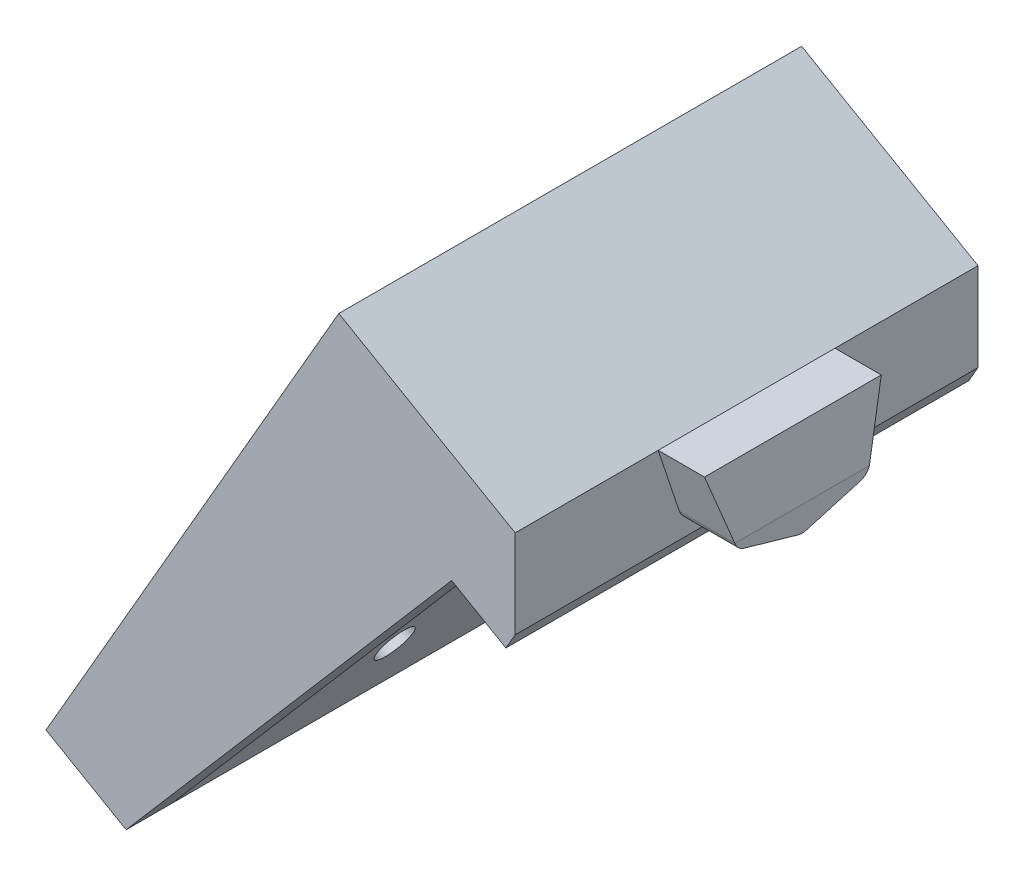
ISO-10303-21;
HEADER;
FILE_DESCRIPTION(('STEP AP214'),'2;1');
FILE_NAME('part.step','',(''),(''),'','','');
FILE_SCHEMA(('AUTOMOTIVE_DESIGN { 1 0 10303 214 1 1 1 1 }'));
ENDSEC;
DATA;
#1=APPLICATION_CONTEXT('core data for automotive mechanical design processes');
#2=APPLICATION_PROTOCOL_DEFINITION('international standard','automotive_design',2000,#1);
#3=PRODUCT_CONTEXT('',#1,'mechanical');
#4=PRODUCT('Part','Part','',(#3));
#5=PRODUCT_RELATED_PRODUCT_CATEGORY('part','',(#4));
#6=PRODUCT_DEFINITION_FORMATION('','',#4);
#7=PRODUCT_DEFINITION_CONTEXT('part definition',#1,'design');
#8=PRODUCT_DEFINITION('design','',#6,#7);
#9=PRODUCT_DEFINITION_SHAPE('','',#8);
#10=(LENGTH_UNIT() NAMED_UNIT(*) SI_UNIT(.MILLI.,.METRE.));
#11=(NAMED_UNIT(*) PLANE_ANGLE_UNIT() SI_UNIT($,.RADIAN.));
#12=(NAMED_UNIT(*) SI_UNIT($,.STERADIAN.) SOLID_ANGLE_UNIT());
#13=UNCERTAINTY_MEASURE_WITH_UNIT(LENGTH_MEASURE(1.E-05),#10,'distance_accuracy_value','');
#14=(GEOMETRIC_REPRESENTATION_CONTEXT(3) GLOBAL_UNCERTAINTY_ASSIGNED_CONTEXT((#13)) GLOBAL_UNIT_ASSIGNED_CONTEXT((#10,
#11,#12)) REPRESENTATION_CONTEXT('',''));
#15=CARTESIAN_POINT('',(0.,0.,0.));
#16=DIRECTION('',(0.,0.,1.));
#17=DIRECTION('',(1.,0.,0.));
#18=AXIS2_PLACEMENT_3D('',#15,#16,#17);
#19=CARTESIAN_POINT('',(-50.6833247791483,-43.7860936139999,25.));
#20=DIRECTION('',(0.499999999999998,0.86602540378444,0.));
#21=DIRECTION('',(-0.86602540378444,0.499999999999998,0.));
#22=AXIS2_PLACEMENT_3D('',#19,#20,#21);
#23=PLANE('',#22);
#24=DIRECTION('',(0.,0.,-1.));
#25=VECTOR('',#24,1.);
#26=CARTESIAN_POINT('',(-42.0230707413039,-48.7860936139999,25.));
#27=LINE('',#26,#25);
#28=CARTESIAN_POINT('',(-42.0230707413039,-48.7860936139999,25.));
#29=VERTEX_POINT('',#28);
#30=CARTESIAN_POINT('',(-42.0230707413039,-48.7860936139999,20.));
#31=VERTEX_POINT('',#30);
#32=EDGE_CURVE('E452',#29,#31,#27,.T.);
#33=ORIENTED_EDGE('',*,*,#32,.F.);
#34=DIRECTION('',(0.86602540378444,-0.499999999999998,0.));
#35=VECTOR('',#34,1.);
#36=CARTESIAN_POINT('',(-50.6833247791483,-43.7860936139999,25.));
#37=LINE('',#36,#35);
#38=CARTESIAN_POINT('',(-50.6833247791483,-43.7860936139999,25.));
#39=VERTEX_POINT('',#38);
#40=EDGE_CURVE('E196',#39,#29,#37,.T.);
#41=ORIENTED_EDGE('',*,*,#40,.F.);
#42=DIRECTION('',(0.,0.,-1.));
#43=VECTOR('',#42,1.);
#44=CARTESIAN_POINT('',(-50.6833247791483,-43.7860936139999,25.));
#45=LINE('',#44,#43);
#46=CARTESIAN_POINT('',(-50.6833247791483,-43.7860936139999,-25.));
#47=VERTEX_POINT('',#46);
#48=EDGE_CURVE('E260',#39,#47,#45,.T.);
#49=ORIENTED_EDGE('',*,*,#48,.T.);
#50=DIRECTION('',(0.86602540378444,-0.499999999999998,0.));
#51=VECTOR('',#50,1.);
#52=CARTESIAN_POINT('',(-50.6833247791483,-43.7860936139999,-25.));
#53=LINE('',#52,#51);
#54=CARTESIAN_POINT('',(-42.0230707413039,-48.7860936139999,-25.));
#55=VERTEX_POINT('',#54);
#56=EDGE_CURVE('E237',#47,#55,#53,.T.);
#57=ORIENTED_EDGE('',*,*,#56,.T.);
#58=CARTESIAN_POINT('',(-42.0230707413039,-48.7860936139999,-20.));
#59=VERTEX_POINT('',#58);
#60=EDGE_CURVE('E197',#59,#55,#27,.T.);
#61=ORIENTED_EDGE('',*,*,#60,.F.);
#62=DIRECTION('',(0.,0.,-1.));
#63=VECTOR('',#62,1.);
#64=CARTESIAN_POINT('',(-42.0230707413039,-48.7860936139999,25.));
#65=LINE('',#64,#63);
#66=EDGE_CURVE('E258',#31,#59,#65,.T.);
#67=ORIENTED_EDGE('',*,*,#66,.F.);
#68=EDGE_LOOP('',(#33,#41,#49,#57,#61,#67));
#69=FACE_BOUND('',#68,.T.);
#70=ADVANCED_FACE('F45',(#69),#23,.F.);
#71=CARTESIAN_POINT('',(0.,0.,25.));
#72=DIRECTION('',(0.,0.,1.));
#73=DIRECTION('',(1.,0.,0.));
#74=AXIS2_PLACEMENT_3D('',#71,#72,#73);
#75=PLANE('',#74);
#76=ORIENTED_EDGE('',*,*,#40,.T.);
#77=DIRECTION('',(-0.651898743000838,-0.758306025872093,0.));
#78=VECTOR('',#77,1.);
#79=CARTESIAN_POINT('',(-42.0230707413039,-48.7860936139999,25.));
#80=LINE('',#79,#78);
#81=CARTESIAN_POINT('',(-6.86281670345966,-7.88674721342455,25.));
#82=VERTEX_POINT('',#81);
#83=EDGE_CURVE('E179',#82,#29,#80,.T.);
#84=ORIENTED_EDGE('',*,*,#83,.F.);
#85=DIRECTION('',(-0.86602540378444,0.499999999999998,0.));
#86=VECTOR('',#85,1.);
#87=CARTESIAN_POINT('',(-1.,-11.2716460153764,25.));
#88=LINE('',#87,#86);
#89=CARTESIAN_POINT('',(-1.,-11.2716460153764,25.));
#90=VERTEX_POINT('',#89);
#91=EDGE_CURVE('E194',#90,#82,#88,.T.);
#92=ORIENTED_EDGE('',*,*,#91,.F.);
#93=DIRECTION('',(0.499999999999998,0.86602540378444,0.));
#94=VECTOR('',#93,1.);
#95=CARTESIAN_POINT('',(-1.,-11.2716460153764,25.));
#96=LINE('',#95,#94);
#97=CARTESIAN_POINT('',(0.,-9.53959520780752,25.));
#98=VERTEX_POINT('',#97);
#99=EDGE_CURVE('E215',#90,#98,#96,.T.);
#100=ORIENTED_EDGE('',*,*,#99,.T.);
#101=DIRECTION('',(0.,-1.,0.));
#102=VECTOR('',#101,1.);
#103=CARTESIAN_POINT('',(0.,0.,25.));
#104=LINE('',#103,#102);
#105=CARTESIAN_POINT('',(0.,0.,25.));
#106=VERTEX_POINT('',#105);
#107=EDGE_CURVE('E248',#106,#98,#104,.T.);
#108=ORIENTED_EDGE('',*,*,#107,.F.);
#109=DIRECTION('',(-0.86602540378444,0.499999999999998,0.));
#110=VECTOR('',#109,1.);
#111=CARTESIAN_POINT('',(0.,0.,25.));
#112=LINE('',#111,#110);
#113=CARTESIAN_POINT('',(-19.0525588832577,11.,25.));
#114=VERTEX_POINT('',#113);
#115=EDGE_CURVE('E242',#106,#114,#112,.T.);
#116=ORIENTED_EDGE('',*,*,#115,.T.);
#117=DIRECTION('',(-0.499999999999998,-0.86602540378444,0.));
#118=VECTOR('',#117,1.);
#119=CARTESIAN_POINT('',(-19.0525588832577,11.,25.));
#120=LINE('',#119,#118);
#121=EDGE_CURVE('E245',#114,#39,#120,.T.);
#122=ORIENTED_EDGE('',*,*,#121,.T.);
#123=EDGE_LOOP('',(#76,#84,#92,#100,#108,#116,#122));
#124=FACE_BOUND('',#123,.T.);
#125=ADVANCED_FACE('F192',(#124),#75,.T.);
#126=CARTESIAN_POINT('',(0.,0.,-25.));
#127=DIRECTION('',(0.,0.,1.));
#128=DIRECTION('',(1.,0.,0.));
#129=AXIS2_PLACEMENT_3D('',#126,#127,#128);
#130=PLANE('',#129);
#131=DIRECTION('',(0.651898743000838,0.758306025872093,0.));
#132=VECTOR('',#131,1.);
#133=CARTESIAN_POINT('',(-0.0475872412977088,0.0409096878126175,-25.));
#134=LINE('',#133,#132);
#135=CARTESIAN_POINT('',(-6.86281670345966,-7.88674721342455,-25.));
#136=VERTEX_POINT('',#135);
#137=EDGE_CURVE('E70',#55,#136,#134,.T.);
#138=ORIENTED_EDGE('',*,*,#137,.F.);
#139=ORIENTED_EDGE('',*,*,#56,.F.);
#140=DIRECTION('',(-0.499999999999998,-0.86602540378444,0.));
#141=VECTOR('',#140,1.);
#142=CARTESIAN_POINT('',(-19.0525588832577,11.,-25.));
#143=LINE('',#142,#141);
#144=CARTESIAN_POINT('',(-19.0525588832577,11.,-25.));
#145=VERTEX_POINT('',#144);
#146=EDGE_CURVE('E234',#145,#47,#143,.T.);
#147=ORIENTED_EDGE('',*,*,#146,.F.);
#148=DIRECTION('',(-0.86602540378444,0.499999999999998,0.));
#149=VECTOR('',#148,1.);
#150=CARTESIAN_POINT('',(0.,0.,-25.));
#151=LINE('',#150,#149);
#152=CARTESIAN_POINT('',(0.,0.,-25.));
#153=VERTEX_POINT('',#152);
#154=EDGE_CURVE('E231',#153,#145,#151,.T.);
#155=ORIENTED_EDGE('',*,*,#154,.F.);
#156=DIRECTION('',(0.,-1.,0.));
#157=VECTOR('',#156,1.);
#158=CARTESIAN_POINT('',(0.,0.,-25.));
#159=LINE('',#158,#157);
#160=CARTESIAN_POINT('',(0.,-9.53959520780752,-25.));
#161=VERTEX_POINT('',#160);
#162=EDGE_CURVE('E240',#153,#161,#159,.T.);
#163=ORIENTED_EDGE('',*,*,#162,.T.);
#164=DIRECTION('',(0.499999999999998,0.86602540378444,0.));
#165=VECTOR('',#164,1.);
#166=CARTESIAN_POINT('',(-1.,-11.2716460153764,-25.));
#167=LINE('',#166,#165);
#168=CARTESIAN_POINT('',(-1.,-11.2716460153764,-25.));
#169=VERTEX_POINT('',#168);
#170=EDGE_CURVE('E217',#169,#161,#167,.T.);
#171=ORIENTED_EDGE('',*,*,#170,.F.);
#172=DIRECTION('',(0.86602540378444,-0.499999999999998,0.));
#173=VECTOR('',#172,1.);
#174=CARTESIAN_POINT('',(-15.5230707413041,-2.88674721342457,-25.));
#175=LINE('',#174,#173);
#176=EDGE_CURVE('E206',#136,#169,#175,.T.);
#177=ORIENTED_EDGE('',*,*,#176,.F.);
#178=EDGE_LOOP('',(#138,#139,#147,#155,#163,#171,#177));
#179=FACE_BOUND('',#178,.T.);
#180=ADVANCED_FACE('F364',(#179),#130,.F.);
#181=CARTESIAN_POINT('',(-6.86281670345965,-7.88674721342454,20.));
#182=DIRECTION('',(0.,0.,1.));
#183=DIRECTION('',(0.,-1.,0.));
#184=AXIS2_PLACEMENT_3D('',#181,#182,#183);
#185=PLANE('',#184);
#186=DIRECTION('',(0.651898743000838,0.758306025872093,0.));
#187=VECTOR('',#186,1.);
#188=CARTESIAN_POINT('',(-6.86281670345965,-7.88674721342454,20.));
#189=LINE('',#188,#187);
#190=CARTESIAN_POINT('',(-6.86281670345966,-7.88674721342455,20.));
#191=VERTEX_POINT('',#190);
#192=EDGE_CURVE('E182',#31,#191,#189,.T.);
#193=ORIENTED_EDGE('',*,*,#192,.F.);
#194=DIRECTION('',(0.499999999999998,0.86602540378444,0.));
#195=VECTOR('',#194,1.);
#196=CARTESIAN_POINT('',(-15.5230707413041,-2.88674721342456,20.));
#197=LINE('',#196,#195);
#198=CARTESIAN_POINT('',(-15.5230707413041,-2.88674721342457,20.));
#199=VERTEX_POINT('',#198);
#200=EDGE_CURVE('E187',#31,#199,#197,.T.);
#201=ORIENTED_EDGE('',*,*,#200,.T.);
#202=DIRECTION('',(-0.86602540378444,0.499999999999998,0.));
#203=VECTOR('',#202,1.);
#204=CARTESIAN_POINT('',(-6.86281670345965,-7.88674721342454,20.));
#205=LINE('',#204,#203);
#206=EDGE_CURVE('E186',#191,#199,#205,.T.);
#207=ORIENTED_EDGE('',*,*,#206,.F.);
#208=EDGE_LOOP('',(#193,#201,#207));
#209=FACE_BOUND('',#208,.T.);
#210=ADVANCED_FACE('F469',(#209),#185,.F.);
#211=CARTESIAN_POINT('',(-6.86281670345965,-7.88674721342454,-20.));
#212=DIRECTION('',(0.,0.,1.));
#213=DIRECTION('',(0.,-1.,0.));
#214=AXIS2_PLACEMENT_3D('',#211,#212,#213);
#215=PLANE('',#214);
#216=DIRECTION('',(0.499999999999998,0.86602540378444,0.));
#217=VECTOR('',#216,1.);
#218=CARTESIAN_POINT('',(-15.5230707413041,-2.88674721342456,-20.));
#219=LINE('',#218,#217);
#220=CARTESIAN_POINT('',(-15.5230707413041,-2.88674721342457,-20.));
#221=VERTEX_POINT('',#220);
#222=EDGE_CURVE('E62',#59,#221,#219,.T.);
#223=ORIENTED_EDGE('',*,*,#222,.F.);
#224=DIRECTION('',(0.651898743000838,0.758306025872093,0.));
#225=VECTOR('',#224,1.);
#226=CARTESIAN_POINT('',(-6.86281670345965,-7.88674721342454,-20.));
#227=LINE('',#226,#225);
#228=CARTESIAN_POINT('',(-6.86281670345966,-7.88674721342455,-20.));
#229=VERTEX_POINT('',#228);
#230=EDGE_CURVE('E454',#59,#229,#227,.T.);
#231=ORIENTED_EDGE('',*,*,#230,.T.);
#232=DIRECTION('',(-0.86602540378444,0.499999999999998,0.));
#233=VECTOR('',#232,1.);
#234=CARTESIAN_POINT('',(-6.86281670345965,-7.88674721342454,-20.));
#235=LINE('',#234,#233);
#236=EDGE_CURVE('E463',#229,#221,#235,.T.);
#237=ORIENTED_EDGE('',*,*,#236,.T.);
#238=EDGE_LOOP('',(#223,#231,#237));
#239=FACE_BOUND('',#238,.T.);
#240=ADVANCED_FACE('F472',(#239),#215,.T.);
#241=CARTESIAN_POINT('',(-42.0230707413039,-48.7860936139999,25.));
#242=DIRECTION('',(-0.86602540378444,0.499999999999998,0.));
#243=DIRECTION('',(-0.499999999999998,-0.86602540378444,0.));
#244=AXIS2_PLACEMENT_3D('',#241,#242,#243);
#245=PLANE('',#244);
#246=CARTESIAN_POINT('',(-38.023070741304,-41.8578903837244,0.));
#247=DIRECTION('',(-0.86602540378444,0.499999999999998,0.));
#248=DIRECTION('',(-0.499999999999998,-0.86602540378444,0.));
#249=AXIS2_PLACEMENT_3D('',#246,#247,#248);
#250=CIRCLE('',#249,2.);
#251=CARTESIAN_POINT('',(-39.023070741304,-43.5899411912932,0.));
#252=VERTEX_POINT('',#251);
#253=EDGE_CURVE('E204',#252,#252,#250,.T.);
#254=ORIENTED_EDGE('',*,*,#253,.T.);
#255=EDGE_LOOP('',(#254));
#256=FACE_BOUND('',#255,.T.);
#257=CARTESIAN_POINT('',(-30.523070741304,-28.8675093269578,0.));
#258=DIRECTION('',(-0.86602540378444,0.499999999999998,0.));
#259=DIRECTION('',(-0.499999999999998,-0.86602540378444,0.));
#260=AXIS2_PLACEMENT_3D('',#257,#258,#259);
#261=CIRCLE('',#260,2.);
#262=CARTESIAN_POINT('',(-31.523070741304,-30.5995601345267,0.));
#263=VERTEX_POINT('',#262);
#264=EDGE_CURVE('E209',#263,#263,#261,.T.);
#265=ORIENTED_EDGE('',*,*,#264,.T.);
#266=EDGE_LOOP('',(#265));
#267=FACE_BOUND('',#266,.T.);
#268=ORIENTED_EDGE('',*,*,#66,.T.);
#269=ORIENTED_EDGE('',*,*,#222,.T.);
#270=DIRECTION('',(0.,0.,-1.));
#271=VECTOR('',#270,1.);
#272=CARTESIAN_POINT('',(-15.5230707413041,-2.88674721342457,25.));
#273=LINE('',#272,#271);
#274=EDGE_CURVE('E203',#199,#221,#273,.T.);
#275=ORIENTED_EDGE('',*,*,#274,.F.);
#276=ORIENTED_EDGE('',*,*,#200,.F.);
#277=EDGE_LOOP('',(#268,#269,#275,#276));
#278=FACE_BOUND('',#277,.T.);
#279=ADVANCED_FACE('F339',(#256,#267,#278),#245,.F.);
#280=CARTESIAN_POINT('',(-5.13076589589079,-8.88674721342454,0.));
#281=DIRECTION('',(-0.499999999999998,-0.86602540378444,0.));
#282=DIRECTION('',(0.86602540378444,-0.499999999999998,0.));
#283=AXIS2_PLACEMENT_3D('',#280,#281,#282);
#284=PLANE('',#283);
#285=DIRECTION('',(0.,0.,1.));
#286=VECTOR('',#285,1.);
#287=CARTESIAN_POINT('',(-6.86281670345965,-7.88674721342454,25.));
#288=LINE('',#287,#286);
#289=EDGE_CURVE('E176',#191,#82,#288,.T.);
#290=ORIENTED_EDGE('',*,*,#289,.F.);
#291=ORIENTED_EDGE('',*,*,#206,.T.);
#292=ORIENTED_EDGE('',*,*,#274,.T.);
#293=ORIENTED_EDGE('',*,*,#236,.F.);
#294=DIRECTION('',(0.,0.,-1.));
#295=VECTOR('',#294,1.);
#296=CARTESIAN_POINT('',(-6.86281670345965,-7.88674721342454,-25.));
#297=LINE('',#296,#295);
#298=EDGE_CURVE('E461',#229,#136,#297,.T.);
#299=ORIENTED_EDGE('',*,*,#298,.T.);
#300=ORIENTED_EDGE('',*,*,#176,.T.);
#301=DIRECTION('',(0.,0.,1.));
#302=VECTOR('',#301,1.);
#303=CARTESIAN_POINT('',(-1.,-11.2716460153764,-25.));
#304=LINE('',#303,#302);
#305=EDGE_CURVE('E201',#169,#90,#304,.T.);
#306=ORIENTED_EDGE('',*,*,#305,.T.);
#307=ORIENTED_EDGE('',*,*,#91,.T.);
#308=EDGE_LOOP('',(#290,#291,#292,#293,#299,#300,#306,#307));
#309=FACE_BOUND('',#308,.T.);
#310=ADVANCED_FACE('F199',(#309),#284,.T.);
#311=CARTESIAN_POINT('',(-46.6833247791484,-36.8578903837244,0.));
#312=DIRECTION('',(-0.86602540378444,0.499999999999998,0.));
#313=DIRECTION('',(-0.499999999999998,-0.86602540378444,0.));
#314=AXIS2_PLACEMENT_3D('',#311,#312,#313);
#315=CYLINDRICAL_SURFACE('',#314,2.);
#316=ORIENTED_EDGE('',*,*,#253,.F.);
#317=EDGE_LOOP('',(#316));
#318=FACE_BOUND('',#317,.T.);
#319=CARTESIAN_POINT('',(-44.085248567795,-38.3578903837244,0.));
#320=DIRECTION('',(-0.86602540378444,0.499999999999998,0.));
#321=DIRECTION('',(-0.499999999999998,-0.86602540378444,0.));
#322=AXIS2_PLACEMENT_3D('',#319,#320,#321);
#323=CIRCLE('',#322,2.);
#324=CARTESIAN_POINT('',(-45.085248567795,-40.0899411912933,0.));
#325=VERTEX_POINT('',#324);
#326=EDGE_CURVE('E49',#325,#325,#323,.F.);
#327=ORIENTED_EDGE('',*,*,#326,.F.);
#328=EDGE_LOOP('',(#327));
#329=FACE_BOUND('',#328,.T.);
#330=ADVANCED_FACE('F345',(#318,#329),#315,.F.);
#331=CARTESIAN_POINT('',(-39.1833247791484,-23.8675093269578,0.));
#332=DIRECTION('',(-0.86602540378444,0.499999999999998,0.));
#333=DIRECTION('',(-0.499999999999998,-0.86602540378444,0.));
#334=AXIS2_PLACEMENT_3D('',#331,#332,#333);
#335=CYLINDRICAL_SURFACE('',#334,2.);
#336=ORIENTED_EDGE('',*,*,#264,.F.);
#337=EDGE_LOOP('',(#336));
#338=FACE_BOUND('',#337,.T.);
#339=CARTESIAN_POINT('',(-36.5852485677951,-25.3675093269578,0.));
#340=DIRECTION('',(-0.86602540378444,0.499999999999998,0.));
#341=DIRECTION('',(-0.499999999999998,-0.86602540378444,0.));
#342=AXIS2_PLACEMENT_3D('',#339,#340,#341);
#343=CIRCLE('',#342,2.);
#344=CARTESIAN_POINT('',(-37.5852485677951,-27.0995601345267,0.));
#345=VERTEX_POINT('',#344);
#346=EDGE_CURVE('E315',#345,#345,#343,.F.);
#347=ORIENTED_EDGE('',*,*,#346,.F.);
#348=EDGE_LOOP('',(#347));
#349=FACE_BOUND('',#348,.T.);
#350=ADVANCED_FACE('F341',(#338,#349),#335,.F.);
#351=CARTESIAN_POINT('',(-19.0525588832577,11.,25.));
#352=DIRECTION('',(0.86602540378444,-0.499999999999998,0.));
#353=DIRECTION('',(0.499999999999998,0.86602540378444,0.));
#354=AXIS2_PLACEMENT_3D('',#351,#352,#353);
#355=PLANE('',#354);
#356=CARTESIAN_POINT('',(-39.1833247791485,-23.8675093269579,0.));
#357=DIRECTION('',(-0.86602540378444,0.499999999999998,0.));
#358=DIRECTION('',(-0.499999999999998,-0.86602540378444,0.));
#359=AXIS2_PLACEMENT_3D('',#356,#357,#358);
#360=CIRCLE('',#359,3.7500000000005);
#361=CARTESIAN_POINT('',(-41.0583247791487,-27.11510459115,0.));
#362=VERTEX_POINT('',#361);
#363=EDGE_CURVE('E322',#362,#362,#360,.T.);
#364=ORIENTED_EDGE('',*,*,#363,.F.);
#365=EDGE_LOOP('',(#364));
#366=FACE_BOUND('',#365,.T.);
#367=CARTESIAN_POINT('',(-46.6833247791486,-36.8578903837248,3.32913026049791E-13));
#368=DIRECTION('',(-0.86602540378444,0.499999999999998,0.));
#369=DIRECTION('',(-0.499999999999998,-0.86602540378444,0.));
#370=AXIS2_PLACEMENT_3D('',#367,#368,#369);
#371=CIRCLE('',#370,3.74999999999927);
#372=CARTESIAN_POINT('',(-48.5583247791483,-40.1054856479159,3.32913026049791E-13));
#373=VERTEX_POINT('',#372);
#374=EDGE_CURVE('E327',#373,#373,#371,.T.);
#375=ORIENTED_EDGE('',*,*,#374,.F.);
#376=EDGE_LOOP('',(#375));
#377=FACE_BOUND('',#376,.T.);
#378=DIRECTION('',(0.,0.,-1.));
#379=VECTOR('',#378,1.);
#380=CARTESIAN_POINT('',(-19.0525588832577,11.,25.));
#381=LINE('',#380,#379);
#382=EDGE_CURVE('E262',#114,#145,#381,.T.);
#383=ORIENTED_EDGE('',*,*,#382,.T.);
#384=ORIENTED_EDGE('',*,*,#146,.T.);
#385=ORIENTED_EDGE('',*,*,#48,.F.);
#386=ORIENTED_EDGE('',*,*,#121,.F.);
#387=EDGE_LOOP('',(#383,#384,#385,#386));
#388=FACE_BOUND('',#387,.T.);
#389=ADVANCED_FACE('F344',(#366,#377,#388),#355,.F.);
#390=CARTESIAN_POINT('',(6.,0.,-9.55));
#391=DIRECTION('',(0.,0.316573765443062,0.94856789479362));
#392=DIRECTION('',(0.,-0.94856789479362,0.316573765443062));
#393=AXIS2_PLACEMENT_3D('',#390,#391,#392);
#394=PLANE('',#393);
#395=DIRECTION('',(-1.,0.,0.));
#396=VECTOR('',#395,1.);
#397=CARTESIAN_POINT('',(6.,0.,-9.55));
#398=LINE('',#397,#396);
#399=CARTESIAN_POINT('',(5.,0.,-9.55));
#400=VERTEX_POINT('',#399);
#401=CARTESIAN_POINT('',(0.,0.,-9.55));
#402=VERTEX_POINT('',#401);
#403=EDGE_CURVE('E285',#400,#402,#398,.T.);
#404=ORIENTED_EDGE('',*,*,#403,.F.);
#405=DIRECTION('',(0.13738157043212,-0.939573763524962,0.313572076245867));
#406=VECTOR('',#405,1.);
#407=CARTESIAN_POINT('',(5.0188736958944,-0.129080119169876,-9.50692097572168));
#408=LINE('',#407,#406);
#409=CARTESIAN_POINT('',(6.,-6.83915433904001,-7.26750988680972));
#410=VERTEX_POINT('',#409);
#411=EDGE_CURVE('E228',#400,#410,#408,.T.);
#412=ORIENTED_EDGE('',*,*,#411,.T.);
#413=DIRECTION('',(-1.,0.,0.));
#414=VECTOR('',#413,1.);
#415=CARTESIAN_POINT('',(6.,-6.83915433904001,-7.26750988680972));
#416=LINE('',#415,#414);
#417=CARTESIAN_POINT('',(0.,-6.83915433904001,-7.26750988680972));
#418=VERTEX_POINT('',#417);
#419=EDGE_CURVE('E11',#410,#418,#416,.T.);
#420=ORIENTED_EDGE('',*,*,#419,.T.);
#421=DIRECTION('',(0.,0.948567894793621,-0.316573765443062));
#422=VECTOR('',#421,1.);
#423=CARTESIAN_POINT('',(0.,0.,-9.55));
#424=LINE('',#423,#422);
#425=EDGE_CURVE('E264',#418,#402,#424,.T.);
#426=ORIENTED_EDGE('',*,*,#425,.T.);
#427=EDGE_LOOP('',(#404,#412,#420,#426));
#428=FACE_BOUND('',#427,.T.);
#429=ADVANCED_FACE('F351',(#428),#394,.F.);
#430=CARTESIAN_POINT('',(6.,0.,9.55));
#431=DIRECTION('',(0.,-1.,0.));
#432=DIRECTION('',(0.,0.,-1.));
#433=AXIS2_PLACEMENT_3D('',#430,#431,#432);
#434=PLANE('',#433);
#435=DIRECTION('',(-1.,0.,0.));
#436=VECTOR('',#435,1.);
#437=CARTESIAN_POINT('',(6.,0.,9.55));
#438=LINE('',#437,#436);
#439=CARTESIAN_POINT('',(5.,0.,9.55));
#440=VERTEX_POINT('',#439);
#441=CARTESIAN_POINT('',(0.,0.,9.55));
#442=VERTEX_POINT('',#441);
#443=EDGE_CURVE('E272',#440,#442,#438,.T.);
#444=ORIENTED_EDGE('',*,*,#443,.F.);
#445=DIRECTION('',(0.,0.,1.));
#446=VECTOR('',#445,1.);
#447=CARTESIAN_POINT('',(5.,0.,-25.));
#448=LINE('',#447,#446);
#449=EDGE_CURVE('E220',#400,#440,#448,.T.);
#450=ORIENTED_EDGE('',*,*,#449,.F.);
#451=ORIENTED_EDGE('',*,*,#403,.T.);
#452=DIRECTION('',(0.,0.,1.));
#453=VECTOR('',#452,1.);
#454=CARTESIAN_POINT('',(0.,0.,9.55));
#455=LINE('',#454,#453);
#456=EDGE_CURVE('E275',#402,#442,#455,.T.);
#457=ORIENTED_EDGE('',*,*,#456,.T.);
#458=EDGE_LOOP('',(#444,#450,#451,#457));
#459=FACE_BOUND('',#458,.T.);
#460=ADVANCED_FACE('F391',(#459),#434,.F.);
#461=CARTESIAN_POINT('',(6.,0.,9.55));
#462=DIRECTION('',(0.,0.316573765443062,-0.94856789479362));
#463=DIRECTION('',(0.,0.94856789479362,0.316573765443062));
#464=AXIS2_PLACEMENT_3D('',#461,#462,#463);
#465=PLANE('',#464);
#466=DIRECTION('',(-1.,0.,0.));
#467=VECTOR('',#466,1.);
#468=CARTESIAN_POINT('',(6.,-6.83915433904001,7.26750988680973));
#469=LINE('',#468,#467);
#470=CARTESIAN_POINT('',(0.,-6.83915433904001,7.26750988680972));
#471=VERTEX_POINT('',#470);
#472=CARTESIAN_POINT('',(6.,-6.83915433904001,7.26750988680972));
#473=VERTEX_POINT('',#472);
#474=EDGE_CURVE('E302',#471,#473,#469,.F.);
#475=ORIENTED_EDGE('',*,*,#474,.T.);
#476=DIRECTION('',(-0.13738157043212,0.939573763524962,0.313572076245867));
#477=VECTOR('',#476,1.);
#478=CARTESIAN_POINT('',(5.0188736958944,-0.129080119169876,9.50692097572168));
#479=LINE('',#478,#477);
#480=EDGE_CURVE('E224',#473,#440,#479,.T.);
#481=ORIENTED_EDGE('',*,*,#480,.T.);
#482=ORIENTED_EDGE('',*,*,#443,.T.);
#483=DIRECTION('',(0.,-0.948567894793621,-0.316573765443062));
#484=VECTOR('',#483,1.);
#485=CARTESIAN_POINT('',(0.,0.,9.55));
#486=LINE('',#485,#484);
#487=EDGE_CURVE('E278',#442,#471,#486,.T.);
#488=ORIENTED_EDGE('',*,*,#487,.T.);
#489=EDGE_LOOP('',(#475,#481,#482,#488));
#490=FACE_BOUND('',#489,.T.);
#491=ADVANCED_FACE('F387',(#490),#465,.F.);
#492=CARTESIAN_POINT('',(6.,-7.58854315834896,7.0174098764555));
#493=DIRECTION('',(0.,0.961289024171987,-0.275542033102881));
#494=DIRECTION('',(0.,0.275542033102881,0.961289024171987));
#495=AXIS2_PLACEMENT_3D('',#492,#493,#494);
#496=PLANE('',#495);
#497=DIRECTION('',(0.,-0.275542033102881,-0.961289024171987));
#498=VECTOR('',#497,1.);
#499=CARTESIAN_POINT('',(6.,-7.58854315834896,7.0174098764555));
#500=LINE('',#499,#498);
#501=CARTESIAN_POINT('',(6.,-7.8062272271334,6.25797109427362));
#502=VERTEX_POINT('',#501);
#503=CARTESIAN_POINT('',(6.,-9.4815287440655,0.413313049654324));
#504=VERTEX_POINT('',#503);
#505=EDGE_CURVE('E265',#502,#504,#500,.T.);
#506=ORIENTED_EDGE('',*,*,#505,.F.);
#507=DIRECTION('',(-1.,0.,0.));
#508=VECTOR('',#507,1.);
#509=CARTESIAN_POINT('',(6.,-7.8062272271334,6.25797109427362));
#510=LINE('',#509,#508);
#511=CARTESIAN_POINT('',(0.,-7.8062272271334,6.25797109427362));
#512=VERTEX_POINT('',#511);
#513=EDGE_CURVE('E289',#502,#512,#510,.T.);
#514=ORIENTED_EDGE('',*,*,#513,.T.);
#515=DIRECTION('',(0.,-0.275542033102881,-0.961289024171987));
#516=VECTOR('',#515,1.);
#517=CARTESIAN_POINT('',(0.,-7.58854315834896,7.0174098764555));
#518=LINE('',#517,#516);
#519=CARTESIAN_POINT('',(0.,-9.4815287440655,0.413313049654324));
#520=VERTEX_POINT('',#519);
#521=EDGE_CURVE('E280',#512,#520,#518,.T.);
#522=ORIENTED_EDGE('',*,*,#521,.T.);
#523=DIRECTION('',(-1.,0.,0.));
#524=VECTOR('',#523,1.);
#525=CARTESIAN_POINT('',(6.,-9.4815287440655,0.413313049654323));
#526=LINE('',#525,#524);
#527=EDGE_CURVE('E287',#520,#504,#526,.F.);
#528=ORIENTED_EDGE('',*,*,#527,.T.);
#529=EDGE_LOOP('',(#506,#514,#522,#528));
#530=FACE_BOUND('',#529,.T.);
#531=ADVANCED_FACE('F383',(#530),#496,.F.);
#532=CARTESIAN_POINT('',(6.,-7.58854315834896,-7.0174098764555));
#533=DIRECTION('',(0.,0.961289024171987,0.275542033102881));
#534=DIRECTION('',(0.,-0.275542033102881,0.961289024171987));
#535=AXIS2_PLACEMENT_3D('',#532,#533,#534);
#536=PLANE('',#535);
#537=DIRECTION('',(0.,0.275542033102881,-0.961289024171987));
#538=VECTOR('',#537,1.);
#539=CARTESIAN_POINT('',(6.,-7.58854315834896,-7.0174098764555));
#540=LINE('',#539,#538);
#541=CARTESIAN_POINT('',(6.,-9.4815287440655,-0.413313049654324));
#542=VERTEX_POINT('',#541);
#543=CARTESIAN_POINT('',(6.,-7.8062272271334,-6.25797109427362));
#544=VERTEX_POINT('',#543);
#545=EDGE_CURVE('E268',#542,#544,#540,.T.);
#546=ORIENTED_EDGE('',*,*,#545,.F.);
#547=DIRECTION('',(-1.,0.,0.));
#548=VECTOR('',#547,1.);
#549=CARTESIAN_POINT('',(6.,-9.4815287440655,-0.413313049654323));
#550=LINE('',#549,#548);
#551=CARTESIAN_POINT('',(0.,-9.4815287440655,-0.413313049654324));
#552=VERTEX_POINT('',#551);
#553=EDGE_CURVE('E54',#542,#552,#550,.T.);
#554=ORIENTED_EDGE('',*,*,#553,.T.);
#555=DIRECTION('',(0.,0.275542033102881,-0.961289024171987));
#556=VECTOR('',#555,1.);
#557=CARTESIAN_POINT('',(0.,-7.58854315834896,-7.0174098764555));
#558=LINE('',#557,#556);
#559=CARTESIAN_POINT('',(0.,-7.8062272271334,-6.25797109427362));
#560=VERTEX_POINT('',#559);
#561=EDGE_CURVE('E269',#552,#560,#558,.T.);
#562=ORIENTED_EDGE('',*,*,#561,.T.);
#563=DIRECTION('',(-1.,0.,0.));
#564=VECTOR('',#563,1.);
#565=CARTESIAN_POINT('',(6.,-7.8062272271334,-6.25797109427362));
#566=LINE('',#565,#564);
#567=EDGE_CURVE('E312',#560,#544,#566,.F.);
#568=ORIENTED_EDGE('',*,*,#567,.T.);
#569=EDGE_LOOP('',(#546,#554,#562,#568));
#570=FACE_BOUND('',#569,.T.);
#571=ADVANCED_FACE('F379',(#570),#536,.F.);
#572=CARTESIAN_POINT('',(6.,0.,0.));
#573=DIRECTION('',(1.,0.,0.));
#574=DIRECTION('',(0.,0.,-1.));
#575=AXIS2_PLACEMENT_3D('',#572,#573,#574);
#576=PLANE('',#575);
#577=DIRECTION('',(0.,0.,1.));
#578=VECTOR('',#577,1.);
#579=CARTESIAN_POINT('',(6.,-6.83915433904001,-25.));
#580=LINE('',#579,#578);
#581=EDGE_CURVE('E221',#410,#473,#580,.T.);
#582=ORIENTED_EDGE('',*,*,#581,.T.);
#583=CARTESIAN_POINT('',(6.,-6.36429369087542,5.84465804461929));
#584=DIRECTION('',(1.,0.,0.));
#585=DIRECTION('',(0.,0.,-1.));
#586=AXIS2_PLACEMENT_3D('',#583,#584,#585);
#587=CIRCLE('',#586,1.5);
#588=EDGE_CURVE('E310',#473,#502,#587,.T.);
#589=ORIENTED_EDGE('',*,*,#588,.T.);
#590=ORIENTED_EDGE('',*,*,#505,.T.);
#591=CARTESIAN_POINT('',(6.,-8.03959520780752,0.));
#592=DIRECTION('',(1.,0.,0.));
#593=DIRECTION('',(0.,0.,-1.));
#594=AXIS2_PLACEMENT_3D('',#591,#592,#593);
#595=CIRCLE('',#594,1.5);
#596=EDGE_CURVE('E308',#504,#542,#595,.T.);
#597=ORIENTED_EDGE('',*,*,#596,.T.);
#598=ORIENTED_EDGE('',*,*,#545,.T.);
#599=CARTESIAN_POINT('',(6.,-6.36429369087542,-5.84465804461929));
#600=DIRECTION('',(1.,0.,0.));
#601=DIRECTION('',(0.,0.,-1.));
#602=AXIS2_PLACEMENT_3D('',#599,#600,#601);
#603=CIRCLE('',#602,1.5);
#604=EDGE_CURVE('E305',#544,#410,#603,.T.);
#605=ORIENTED_EDGE('',*,*,#604,.T.);
#606=EDGE_LOOP('',(#582,#589,#590,#597,#598,#605));
#607=FACE_BOUND('',#606,.T.);
#608=ADVANCED_FACE('F375',(#607),#576,.T.);
#609=CARTESIAN_POINT('',(6.,-6.36429369087542,5.84465804461929));
#610=DIRECTION('',(-1.,0.,0.));
#611=DIRECTION('',(0.,0.,1.));
#612=AXIS2_PLACEMENT_3D('',#609,#610,#611);
#613=CYLINDRICAL_SURFACE('',#612,1.5);
#614=ORIENTED_EDGE('',*,*,#588,.F.);
#615=ORIENTED_EDGE('',*,*,#474,.F.);
#616=CARTESIAN_POINT('',(0.,-6.36429369087542,5.84465804461929));
#617=DIRECTION('',(1.,0.,0.));
#618=DIRECTION('',(0.,0.,-1.));
#619=AXIS2_PLACEMENT_3D('',#616,#617,#618);
#620=CIRCLE('',#619,1.5);
#621=EDGE_CURVE('E299',#512,#471,#620,.F.);
#622=ORIENTED_EDGE('',*,*,#621,.F.);
#623=ORIENTED_EDGE('',*,*,#513,.F.);
#624=EDGE_LOOP('',(#614,#615,#622,#623));
#625=FACE_BOUND('',#624,.T.);
#626=ADVANCED_FACE('F378',(#625),#613,.T.);
#627=CARTESIAN_POINT('',(6.,-8.03959520780752,0.));
#628=DIRECTION('',(-1.,0.,0.));
#629=DIRECTION('',(0.,0.,1.));
#630=AXIS2_PLACEMENT_3D('',#627,#628,#629);
#631=CYLINDRICAL_SURFACE('',#630,1.5);
#632=ORIENTED_EDGE('',*,*,#596,.F.);
#633=ORIENTED_EDGE('',*,*,#527,.F.);
#634=CARTESIAN_POINT('',(0.,-8.03959520780752,0.));
#635=DIRECTION('',(1.,0.,0.));
#636=DIRECTION('',(0.,0.,-1.));
#637=AXIS2_PLACEMENT_3D('',#634,#635,#636);
#638=CIRCLE('',#637,1.5);
#639=CARTESIAN_POINT('',(0.,-9.53959520780752,0.));
#640=VERTEX_POINT('',#639);
#641=EDGE_CURVE('E295',#640,#520,#638,.F.);
#642=ORIENTED_EDGE('',*,*,#641,.F.);
#643=EDGE_CURVE('E296',#552,#640,#638,.F.);
#644=ORIENTED_EDGE('',*,*,#643,.F.);
#645=ORIENTED_EDGE('',*,*,#553,.F.);
#646=EDGE_LOOP('',(#632,#633,#642,#644,#645));
#647=FACE_BOUND('',#646,.T.);
#648=ADVANCED_FACE('F400',(#647),#631,.T.);
#649=CARTESIAN_POINT('',(6.,-6.36429369087542,-5.84465804461929));
#650=DIRECTION('',(-1.,0.,0.));
#651=DIRECTION('',(0.,0.,1.));
#652=AXIS2_PLACEMENT_3D('',#649,#650,#651);
#653=CYLINDRICAL_SURFACE('',#652,1.5);
#654=ORIENTED_EDGE('',*,*,#604,.F.);
#655=ORIENTED_EDGE('',*,*,#567,.F.);
#656=CARTESIAN_POINT('',(0.,-6.36429369087542,-5.84465804461929));
#657=DIRECTION('',(1.,0.,0.));
#658=DIRECTION('',(0.,0.,-1.));
#659=AXIS2_PLACEMENT_3D('',#656,#657,#658);
#660=CIRCLE('',#659,1.5);
#661=EDGE_CURVE('E292',#418,#560,#660,.F.);
#662=ORIENTED_EDGE('',*,*,#661,.F.);
#663=ORIENTED_EDGE('',*,*,#419,.F.);
#664=EDGE_LOOP('',(#654,#655,#662,#663));
#665=FACE_BOUND('',#664,.T.);
#666=ADVANCED_FACE('F47',(#665),#653,.T.);
#667=CARTESIAN_POINT('',(0.,0.,25.));
#668=DIRECTION('',(1.,0.,0.));
#669=DIRECTION('',(0.,0.,-1.));
#670=AXIS2_PLACEMENT_3D('',#667,#668,#669);
#671=PLANE('',#670);
#672=ORIENTED_EDGE('',*,*,#487,.F.);
#673=DIRECTION('',(0.,0.,-1.));
#674=VECTOR('',#673,1.);
#675=CARTESIAN_POINT('',(0.,0.,25.));
#676=LINE('',#675,#674);
#677=EDGE_CURVE('E251',#106,#442,#676,.T.);
#678=ORIENTED_EDGE('',*,*,#677,.F.);
#679=ORIENTED_EDGE('',*,*,#107,.T.);
#680=DIRECTION('',(0.,0.,-1.));
#681=VECTOR('',#680,1.);
#682=CARTESIAN_POINT('',(0.,-9.53959520780752,25.));
#683=LINE('',#682,#681);
#684=EDGE_CURVE('E255',#98,#640,#683,.T.);
#685=ORIENTED_EDGE('',*,*,#684,.T.);
#686=ORIENTED_EDGE('',*,*,#641,.T.);
#687=ORIENTED_EDGE('',*,*,#521,.F.);
#688=ORIENTED_EDGE('',*,*,#621,.T.);
#689=EDGE_LOOP('',(#672,#678,#679,#685,#686,#687,#688));
#690=FACE_BOUND('',#689,.T.);
#691=ADVANCED_FACE('F409',(#690),#671,.T.);
#692=ORIENTED_EDGE('',*,*,#425,.F.);
#693=ORIENTED_EDGE('',*,*,#661,.T.);
#694=ORIENTED_EDGE('',*,*,#561,.F.);
#695=ORIENTED_EDGE('',*,*,#643,.T.);
#696=EDGE_CURVE('E254',#640,#161,#683,.T.);
#697=ORIENTED_EDGE('',*,*,#696,.T.);
#698=ORIENTED_EDGE('',*,*,#162,.F.);
#699=EDGE_CURVE('E250',#402,#153,#676,.T.);
#700=ORIENTED_EDGE('',*,*,#699,.F.);
#701=EDGE_LOOP('',(#692,#693,#694,#695,#697,#698,#700));
#702=FACE_BOUND('',#701,.T.);
#703=ADVANCED_FACE('F373',(#702),#671,.T.);
#704=CARTESIAN_POINT('',(0.,0.,25.));
#705=DIRECTION('',(-0.499999999999998,-0.86602540378444,0.));
#706=DIRECTION('',(0.86602540378444,-0.499999999999998,0.));
#707=AXIS2_PLACEMENT_3D('',#704,#705,#706);
#708=PLANE('',#707);
#709=ORIENTED_EDGE('',*,*,#677,.T.);
#710=ORIENTED_EDGE('',*,*,#456,.F.);
#711=ORIENTED_EDGE('',*,*,#699,.T.);
#712=ORIENTED_EDGE('',*,*,#154,.T.);
#713=ORIENTED_EDGE('',*,*,#382,.F.);
#714=ORIENTED_EDGE('',*,*,#115,.F.);
#715=EDGE_LOOP('',(#709,#710,#711,#712,#713,#714));
#716=FACE_BOUND('',#715,.T.);
#717=ADVANCED_FACE('F369',(#716),#708,.F.);
#718=CARTESIAN_POINT('',(6.,-6.83915433904001,-25.));
#719=DIRECTION('',(-0.989478714483058,-0.144678518049345,0.));
#720=DIRECTION('',(0.144678518049345,-0.989478714483058,0.));
#721=AXIS2_PLACEMENT_3D('',#718,#719,#720);
#722=PLANE('',#721);
#723=ORIENTED_EDGE('',*,*,#449,.T.);
#724=ORIENTED_EDGE('',*,*,#480,.F.);
#725=ORIENTED_EDGE('',*,*,#581,.F.);
#726=ORIENTED_EDGE('',*,*,#411,.F.);
#727=EDGE_LOOP('',(#723,#724,#725,#726));
#728=FACE_BOUND('',#727,.T.);
#729=ADVANCED_FACE('F372',(#728),#722,.F.);
#730=CARTESIAN_POINT('',(-0.999999999999996,-11.2716460153764,0.));
#731=DIRECTION('',(-0.86602540378444,0.499999999999998,0.));
#732=DIRECTION('',(-0.499999999999998,-0.86602540378444,0.));
#733=AXIS2_PLACEMENT_3D('',#730,#731,#732);
#734=PLANE('',#733);
#735=ORIENTED_EDGE('',*,*,#696,.F.);
#736=ORIENTED_EDGE('',*,*,#684,.F.);
#737=ORIENTED_EDGE('',*,*,#99,.F.);
#738=ORIENTED_EDGE('',*,*,#305,.F.);
#739=ORIENTED_EDGE('',*,*,#170,.T.);
#740=EDGE_LOOP('',(#735,#736,#737,#738,#739));
#741=FACE_BOUND('',#740,.T.);
#742=ADVANCED_FACE('F441',(#741),#734,.F.);
#743=CARTESIAN_POINT('',(-36.5852485677952,-25.3675093269579,0.));
#744=DIRECTION('',(-0.86602540378444,0.499999999999998,0.));
#745=DIRECTION('',(-0.499999999999998,-0.86602540378444,0.));
#746=AXIS2_PLACEMENT_3D('',#743,#744,#745);
#747=PLANE('',#746);
#748=CARTESIAN_POINT('',(-36.5852485677952,-25.3675093269579,0.));
#749=DIRECTION('',(-0.86602540378444,0.499999999999998,0.));
#750=DIRECTION('',(-0.499999999999998,-0.86602540378444,0.));
#751=AXIS2_PLACEMENT_3D('',#748,#749,#750);
#752=CIRCLE('',#751,3.7500000000005);
#753=CARTESIAN_POINT('',(-38.4602485677954,-28.61510459115,0.));
#754=VERTEX_POINT('',#753);
#755=EDGE_CURVE('E317',#754,#754,#752,.T.);
#756=ORIENTED_EDGE('',*,*,#755,.T.);
#757=EDGE_LOOP('',(#756));
#758=FACE_BOUND('',#757,.T.);
#759=ORIENTED_EDGE('',*,*,#346,.T.);
#760=EDGE_LOOP('',(#759));
#761=FACE_BOUND('',#760,.T.);
#762=ADVANCED_FACE('F489',(#758,#761),#747,.T.);
#763=CARTESIAN_POINT('',(-36.5852485677952,-25.3675093269579,0.));
#764=DIRECTION('',(-0.86602540378444,0.499999999999998,0.));
#765=DIRECTION('',(-0.499999999999998,-0.86602540378444,0.));
#766=AXIS2_PLACEMENT_3D('',#763,#764,#765);
#767=CYLINDRICAL_SURFACE('',#766,3.7500000000005);
#768=ORIENTED_EDGE('',*,*,#755,.F.);
#769=EDGE_LOOP('',(#768));
#770=FACE_BOUND('',#769,.T.);
#771=ORIENTED_EDGE('',*,*,#363,.T.);
#772=EDGE_LOOP('',(#771));
#773=FACE_BOUND('',#772,.T.);
#774=ADVANCED_FACE('F492',(#770,#773),#767,.F.);
#775=CARTESIAN_POINT('',(-44.0852485677953,-38.3578903837248,3.32913026049791E-13));
#776=DIRECTION('',(-0.86602540378444,0.499999999999998,0.));
#777=DIRECTION('',(-0.499999999999998,-0.86602540378444,0.));
#778=AXIS2_PLACEMENT_3D('',#775,#776,#777);
#779=PLANE('',#778);
#780=CARTESIAN_POINT('',(-44.0852485677953,-38.3578903837248,3.32913026049791E-13));
#781=DIRECTION('',(-0.86602540378444,0.499999999999998,0.));
#782=DIRECTION('',(-0.499999999999998,-0.86602540378444,0.));
#783=AXIS2_PLACEMENT_3D('',#780,#781,#782);
#784=CIRCLE('',#783,3.74999999999927);
#785=CARTESIAN_POINT('',(-45.9602485677949,-41.6054856479158,3.32913026049791E-13));
#786=VERTEX_POINT('',#785);
#787=EDGE_CURVE('E334',#786,#786,#784,.T.);
#788=ORIENTED_EDGE('',*,*,#787,.T.);
#789=EDGE_LOOP('',(#788));
#790=FACE_BOUND('',#789,.T.);
#791=ORIENTED_EDGE('',*,*,#326,.T.);
#792=EDGE_LOOP('',(#791));
#793=FACE_BOUND('',#792,.T.);
#794=ADVANCED_FACE('F481',(#790,#793),#779,.T.);
#795=CARTESIAN_POINT('',(-44.0852485677953,-38.3578903837248,3.32913026049791E-13));
#796=DIRECTION('',(-0.86602540378444,0.499999999999998,0.));
#797=DIRECTION('',(-0.499999999999998,-0.86602540378444,0.));
#798=AXIS2_PLACEMENT_3D('',#795,#796,#797);
#799=CYLINDRICAL_SURFACE('',#798,3.74999999999927);
#800=ORIENTED_EDGE('',*,*,#787,.F.);
#801=EDGE_LOOP('',(#800));
#802=FACE_BOUND('',#801,.T.);
#803=ORIENTED_EDGE('',*,*,#374,.T.);
#804=EDGE_LOOP('',(#803));
#805=FACE_BOUND('',#804,.T.);
#806=ADVANCED_FACE('F475',(#802,#805),#799,.F.);
#807=CARTESIAN_POINT('',(-42.0230707413039,-48.7860936139999,25.));
#808=DIRECTION('',(0.758306025872093,-0.651898743000838,0.));
#809=DIRECTION('',(0.651898743000838,0.758306025872093,0.));
#810=AXIS2_PLACEMENT_3D('',#807,#808,#809);
#811=PLANE('',#810);
#812=ORIENTED_EDGE('',*,*,#137,.T.);
#813=ORIENTED_EDGE('',*,*,#298,.F.);
#814=ORIENTED_EDGE('',*,*,#230,.F.);
#815=ORIENTED_EDGE('',*,*,#60,.T.);
#816=EDGE_LOOP('',(#812,#813,#814,#815));
#817=FACE_BOUND('',#816,.T.);
#818=ADVANCED_FACE('F473',(#817),#811,.T.);
#819=ORIENTED_EDGE('',*,*,#192,.T.);
#820=ORIENTED_EDGE('',*,*,#289,.T.);
#821=ORIENTED_EDGE('',*,*,#83,.T.);
#822=ORIENTED_EDGE('',*,*,#32,.T.);
#823=EDGE_LOOP('',(#819,#820,#821,#822));
#824=FACE_BOUND('',#823,.T.);
#825=ADVANCED_FACE('F178',(#824),#811,.T.);
#826=CLOSED_SHELL('',(#70,#125,#180,#210,#240,#279,#310,#330,#350,#389,#429,#460,#491,#531,#571,
#608,#626,#648,#666,#691,#703,#717,#729,#742,#762,#774,#794,#806,#818,#825));
#827=MANIFOLD_SOLID_BREP('B2',#826);
#828=ADVANCED_BREP_SHAPE_REPRESENTATION('',(#18,#827),#14);
#829=SHAPE_DEFINITION_REPRESENTATION(#9,#828);
ENDSEC;
END-ISO-10303-21;
